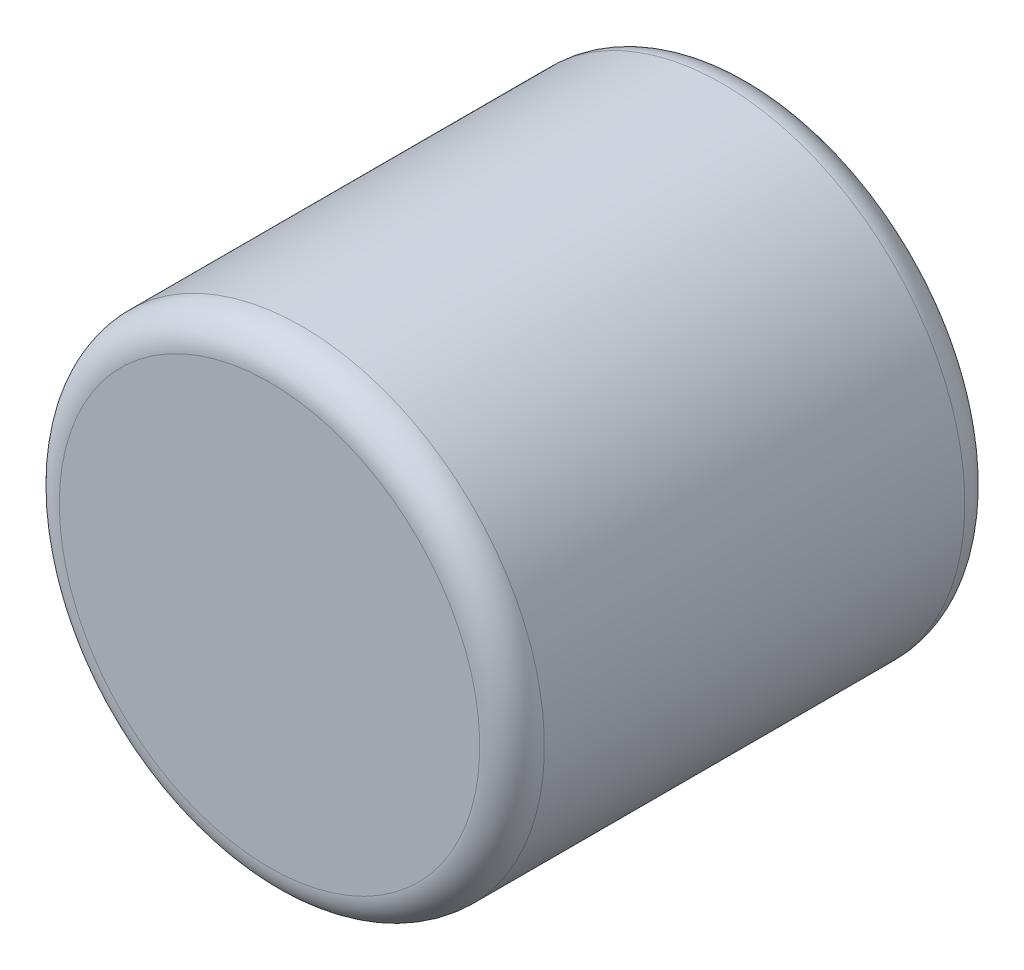
ISO-10303-21;
HEADER;
FILE_DESCRIPTION(('STEP AP214'),'2;1');
FILE_NAME('part.step','',(''),(''),'','','');
FILE_SCHEMA(('AUTOMOTIVE_DESIGN { 1 0 10303 214 1 1 1 1 }'));
ENDSEC;
DATA;
#1=APPLICATION_CONTEXT('core data for automotive mechanical design processes');
#2=APPLICATION_PROTOCOL_DEFINITION('international standard','automotive_design',2000,#1);
#3=PRODUCT_CONTEXT('',#1,'mechanical');
#4=PRODUCT('Part','Part','',(#3));
#5=PRODUCT_RELATED_PRODUCT_CATEGORY('part','',(#4));
#6=PRODUCT_DEFINITION_FORMATION('','',#4);
#7=PRODUCT_DEFINITION_CONTEXT('part definition',#1,'design');
#8=PRODUCT_DEFINITION('design','',#6,#7);
#9=PRODUCT_DEFINITION_SHAPE('','',#8);
#10=(LENGTH_UNIT() NAMED_UNIT(*) SI_UNIT(.MILLI.,.METRE.));
#11=(NAMED_UNIT(*) PLANE_ANGLE_UNIT() SI_UNIT($,.RADIAN.));
#12=(NAMED_UNIT(*) SI_UNIT($,.STERADIAN.) SOLID_ANGLE_UNIT());
#13=UNCERTAINTY_MEASURE_WITH_UNIT(LENGTH_MEASURE(1.E-05),#10,'distance_accuracy_value','');
#14=(GEOMETRIC_REPRESENTATION_CONTEXT(3) GLOBAL_UNCERTAINTY_ASSIGNED_CONTEXT((#13)) GLOBAL_UNIT_ASSIGNED_CONTEXT((#10,
#11,#12)) REPRESENTATION_CONTEXT('',''));
#15=CARTESIAN_POINT('',(0.,0.,0.));
#16=DIRECTION('',(0.,0.,1.));
#17=DIRECTION('',(1.,0.,0.));
#18=AXIS2_PLACEMENT_3D('',#15,#16,#17);
#19=CARTESIAN_POINT('',(0.,0.,0.));
#20=DIRECTION('',(0.,0.,1.));
#21=DIRECTION('',(1.,0.,0.));
#22=AXIS2_PLACEMENT_3D('',#19,#20,#21);
#23=PLANE('',#22);
#24=CARTESIAN_POINT('',(0.,0.,0.));
#25=DIRECTION('',(0.,0.,-1.));
#26=DIRECTION('',(-1.,0.,0.));
#27=AXIS2_PLACEMENT_3D('',#24,#25,#26);
#28=CIRCLE('',#27,1.3);
#29=CARTESIAN_POINT('',(-1.3,0.,0.));
#30=VERTEX_POINT('',#29);
#31=EDGE_CURVE('E10',#30,#30,#28,.T.);
#32=ORIENTED_EDGE('',*,*,#31,.T.);
#33=EDGE_LOOP('',(#32));
#34=FACE_BOUND('',#33,.T.);
#35=ADVANCED_FACE('F32',(#34),#23,.F.);
#36=CARTESIAN_POINT('',(0.,0.,0.2));
#37=DIRECTION('',(0.,0.,-1.));
#38=DIRECTION('',(-1.,0.,0.));
#39=AXIS2_PLACEMENT_3D('',#36,#37,#38);
#40=TOROIDAL_SURFACE('',#39,1.3,0.2);
#41=ORIENTED_EDGE('',*,*,#31,.F.);
#42=EDGE_LOOP('',(#41));
#43=FACE_BOUND('',#42,.T.);
#44=CARTESIAN_POINT('',(0.,0.,0.2));
#45=DIRECTION('',(0.,0.,-1.));
#46=DIRECTION('',(-1.,0.,0.));
#47=AXIS2_PLACEMENT_3D('',#44,#45,#46);
#48=CIRCLE('',#47,1.5);
#49=CARTESIAN_POINT('',(-1.5,0.,0.2));
#50=VERTEX_POINT('',#49);
#51=EDGE_CURVE('E38',#50,#50,#48,.T.);
#52=ORIENTED_EDGE('',*,*,#51,.T.);
#53=EDGE_LOOP('',(#52));
#54=FACE_BOUND('',#53,.T.);
#55=ADVANCED_FACE('F64',(#43,#54),#40,.T.);
#56=CARTESIAN_POINT('',(0.,0.,0.));
#57=DIRECTION('',(0.,0.,-1.));
#58=DIRECTION('',(-1.,0.,0.));
#59=AXIS2_PLACEMENT_3D('',#56,#57,#58);
#60=CYLINDRICAL_SURFACE('',#59,1.5);
#61=ORIENTED_EDGE('',*,*,#51,.F.);
#62=EDGE_LOOP('',(#61));
#63=FACE_BOUND('',#62,.T.);
#64=CARTESIAN_POINT('',(0.,0.,2.8));
#65=DIRECTION('',(0.,0.,-1.));
#66=DIRECTION('',(-1.,0.,0.));
#67=AXIS2_PLACEMENT_3D('',#64,#65,#66);
#68=CIRCLE('',#67,1.5);
#69=CARTESIAN_POINT('',(-1.5,0.,2.8));
#70=VERTEX_POINT('',#69);
#71=EDGE_CURVE('E42',#70,#70,#68,.T.);
#72=ORIENTED_EDGE('',*,*,#71,.T.);
#73=EDGE_LOOP('',(#72));
#74=FACE_BOUND('',#73,.T.);
#75=ADVANCED_FACE('F60',(#63,#74),#60,.T.);
#76=CARTESIAN_POINT('',(0.,0.,2.8));
#77=DIRECTION('',(0.,0.,-1.));
#78=DIRECTION('',(-1.,0.,0.));
#79=AXIS2_PLACEMENT_3D('',#76,#77,#78);
#80=TOROIDAL_SURFACE('',#79,1.3,0.2);
#81=ORIENTED_EDGE('',*,*,#71,.F.);
#82=EDGE_LOOP('',(#81));
#83=FACE_BOUND('',#82,.T.);
#84=CARTESIAN_POINT('',(0.,0.,3.));
#85=DIRECTION('',(0.,0.,-1.));
#86=DIRECTION('',(-1.,0.,0.));
#87=AXIS2_PLACEMENT_3D('',#84,#85,#86);
#88=CIRCLE('',#87,1.3);
#89=CARTESIAN_POINT('',(-1.3,0.,3.));
#90=VERTEX_POINT('',#89);
#91=EDGE_CURVE('E46',#90,#90,#88,.T.);
#92=ORIENTED_EDGE('',*,*,#91,.T.);
#93=EDGE_LOOP('',(#92));
#94=FACE_BOUND('',#93,.T.);
#95=ADVANCED_FACE('F52',(#83,#94),#80,.T.);
#96=CARTESIAN_POINT('',(0.,-1.3,3.));
#97=DIRECTION('',(0.,0.,-1.));
#98=DIRECTION('',(-1.,0.,0.));
#99=AXIS2_PLACEMENT_3D('',#96,#97,#98);
#100=PLANE('',#99);
#101=ORIENTED_EDGE('',*,*,#91,.F.);
#102=EDGE_LOOP('',(#101));
#103=FACE_BOUND('',#102,.T.);
#104=ADVANCED_FACE('F54',(#103),#100,.F.);
#105=CLOSED_SHELL('',(#35,#55,#75,#95,#104));
#106=MANIFOLD_SOLID_BREP('B2',#105);
#107=ADVANCED_BREP_SHAPE_REPRESENTATION('',(#18,#106),#14);
#108=SHAPE_DEFINITION_REPRESENTATION(#9,#107);
ENDSEC;
END-ISO-10303-21;
